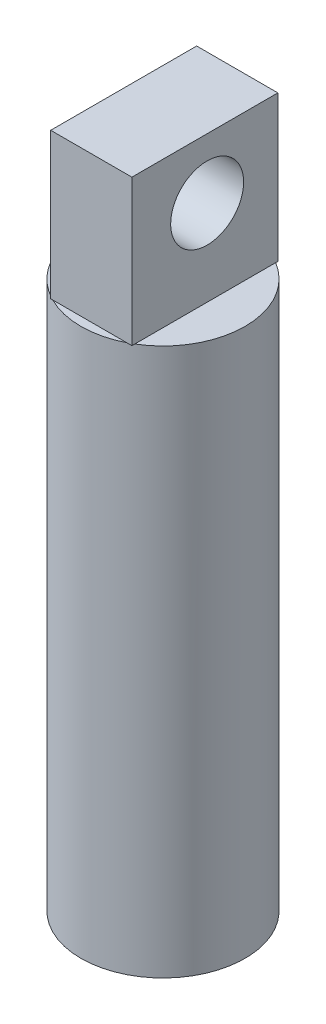
ISO-10303-21;
HEADER;
FILE_DESCRIPTION(('STEP AP214'),'2;1');
FILE_NAME('part.step','',(''),(''),'','','');
FILE_SCHEMA(('AUTOMOTIVE_DESIGN { 1 0 10303 214 1 1 1 1 }'));
ENDSEC;
DATA;
#1=APPLICATION_CONTEXT('core data for automotive mechanical design processes');
#2=APPLICATION_PROTOCOL_DEFINITION('international standard','automotive_design',2000,#1);
#3=PRODUCT_CONTEXT('',#1,'mechanical');
#4=PRODUCT('Part','Part','',(#3));
#5=PRODUCT_RELATED_PRODUCT_CATEGORY('part','',(#4));
#6=PRODUCT_DEFINITION_FORMATION('','',#4);
#7=PRODUCT_DEFINITION_CONTEXT('part definition',#1,'design');
#8=PRODUCT_DEFINITION('design','',#6,#7);
#9=PRODUCT_DEFINITION_SHAPE('','',#8);
#10=(LENGTH_UNIT() NAMED_UNIT(*) SI_UNIT(.MILLI.,.METRE.));
#11=(NAMED_UNIT(*) PLANE_ANGLE_UNIT() SI_UNIT($,.RADIAN.));
#12=(NAMED_UNIT(*) SI_UNIT($,.STERADIAN.) SOLID_ANGLE_UNIT());
#13=UNCERTAINTY_MEASURE_WITH_UNIT(LENGTH_MEASURE(1.E-05),#10,'distance_accuracy_value','');
#14=(GEOMETRIC_REPRESENTATION_CONTEXT(3) GLOBAL_UNCERTAINTY_ASSIGNED_CONTEXT((#13)) GLOBAL_UNIT_ASSIGNED_CONTEXT((#10,
#11,#12)) REPRESENTATION_CONTEXT('',''));
#15=CARTESIAN_POINT('',(0.,0.,0.));
#16=DIRECTION('',(0.,0.,1.));
#17=DIRECTION('',(1.,0.,0.));
#18=AXIS2_PLACEMENT_3D('',#15,#16,#17);
#19=CARTESIAN_POINT('',(-2.13739498432602,-5.30033333333333,8.));
#20=DIRECTION('',(0.,1.,0.));
#21=DIRECTION('',(0.,0.,1.));
#22=AXIS2_PLACEMENT_3D('',#19,#20,#21);
#23=PLANE('',#22);
#24=CARTESIAN_POINT('',(0.,-5.30033333333333,3.98343503850757));
#25=DIRECTION('',(0.,-1.,0.));
#26=DIRECTION('',(0.,0.,-1.));
#27=AXIS2_PLACEMENT_3D('',#24,#25,#26);
#28=CIRCLE('',#27,4.5);
#29=CARTESIAN_POINT('',(2.09338130640125,-5.30033333333333,0.));
#30=VERTEX_POINT('',#29);
#31=CARTESIAN_POINT('',(2.31260501567398,-5.30033333333333,0.123142557168939));
#32=VERTEX_POINT('',#31);
#33=EDGE_CURVE('E126',#30,#32,#28,.T.);
#34=ORIENTED_EDGE('',*,*,#33,.F.);
#35=DIRECTION('',(1.,0.,0.));
#36=VECTOR('',#35,1.);
#37=CARTESIAN_POINT('',(-2.13739498432602,-5.30033333333333,0.));
#38=LINE('',#37,#36);
#39=CARTESIAN_POINT('',(2.31260501567398,-5.30033333333333,0.));
#40=VERTEX_POINT('',#39);
#41=EDGE_CURVE('E111',#30,#40,#38,.T.);
#42=ORIENTED_EDGE('',*,*,#41,.T.);
#43=DIRECTION('',(0.,0.,-1.));
#44=VECTOR('',#43,1.);
#45=CARTESIAN_POINT('',(2.31260501567398,-5.30033333333333,8.));
#46=LINE('',#45,#44);
#47=EDGE_CURVE('E166',#32,#40,#46,.T.);
#48=ORIENTED_EDGE('',*,*,#47,.F.);
#49=EDGE_LOOP('',(#34,#42,#48));
#50=FACE_BOUND('',#49,.T.);
#51=ADVANCED_FACE('F34',(#50),#23,.F.);
#52=CARTESIAN_POINT('',(2.31260501567398,-5.30033333333333,7.8437275198462));
#53=VERTEX_POINT('',#52);
#54=CARTESIAN_POINT('',(2.02908992164253,-5.30033333333333,8.));
#55=VERTEX_POINT('',#54);
#56=EDGE_CURVE('E11',#53,#55,#28,.T.);
#57=ORIENTED_EDGE('',*,*,#56,.F.);
#58=CARTESIAN_POINT('',(2.31260501567398,-5.30033333333333,8.));
#59=VERTEX_POINT('',#58);
#60=EDGE_CURVE('E167',#59,#53,#46,.T.);
#61=ORIENTED_EDGE('',*,*,#60,.F.);
#62=DIRECTION('',(1.,0.,0.));
#63=VECTOR('',#62,1.);
#64=CARTESIAN_POINT('',(-2.13739498432602,-5.30033333333333,8.));
#65=LINE('',#64,#63);
#66=EDGE_CURVE('E149',#55,#59,#65,.T.);
#67=ORIENTED_EDGE('',*,*,#66,.F.);
#68=EDGE_LOOP('',(#57,#61,#67));
#69=FACE_BOUND('',#68,.T.);
#70=ADVANCED_FACE('F187',(#69),#23,.F.);
#71=CARTESIAN_POINT('',(-2.02908992164253,-5.30033333333333,8.));
#72=VERTEX_POINT('',#71);
#73=CARTESIAN_POINT('',(-2.13739498432602,-5.30033333333333,7.9434278012507));
#74=VERTEX_POINT('',#73);
#75=EDGE_CURVE('E43',#72,#74,#28,.T.);
#76=ORIENTED_EDGE('',*,*,#75,.F.);
#77=CARTESIAN_POINT('',(-2.13739498432602,-5.30033333333333,8.));
#78=VERTEX_POINT('',#77);
#79=EDGE_CURVE('E148',#78,#72,#65,.T.);
#80=ORIENTED_EDGE('',*,*,#79,.F.);
#81=DIRECTION('',(0.,0.,-1.));
#82=VECTOR('',#81,1.);
#83=CARTESIAN_POINT('',(-2.13739498432602,-5.30033333333333,8.));
#84=LINE('',#83,#82);
#85=EDGE_CURVE('E38',#78,#74,#84,.T.);
#86=ORIENTED_EDGE('',*,*,#85,.T.);
#87=EDGE_LOOP('',(#76,#80,#86));
#88=FACE_BOUND('',#87,.T.);
#89=ADVANCED_FACE('F189',(#88),#23,.F.);
#90=CARTESIAN_POINT('',(-2.13739498432602,2.69966666666667,8.));
#91=DIRECTION('',(1.,0.,0.));
#92=DIRECTION('',(0.,1.,0.));
#93=AXIS2_PLACEMENT_3D('',#90,#91,#92);
#94=PLANE('',#93);
#95=CARTESIAN_POINT('',(-2.13739498432602,-0.589342017035122,3.87570666961495));
#96=DIRECTION('',(1.,0.,0.));
#97=DIRECTION('',(0.,1.,0.));
#98=AXIS2_PLACEMENT_3D('',#95,#96,#97);
#99=CIRCLE('',#98,2.);
#100=CARTESIAN_POINT('',(-2.13739498432602,1.41065798296488,3.87570666961495));
#101=VERTEX_POINT('',#100);
#102=EDGE_CURVE('E125',#101,#101,#99,.T.);
#103=ORIENTED_EDGE('',*,*,#102,.T.);
#104=EDGE_LOOP('',(#103));
#105=FACE_BOUND('',#104,.T.);
#106=DIRECTION('',(0.,-1.,0.));
#107=VECTOR('',#106,1.);
#108=CARTESIAN_POINT('',(-2.13739498432602,2.69966666666667,0.));
#109=LINE('',#108,#107);
#110=CARTESIAN_POINT('',(-2.13739498432602,2.69966666666667,0.));
#111=VERTEX_POINT('',#110);
#112=CARTESIAN_POINT('',(-2.13739498432602,-5.30033333333333,0.));
#113=VERTEX_POINT('',#112);
#114=EDGE_CURVE('E136',#111,#113,#109,.T.);
#115=ORIENTED_EDGE('',*,*,#114,.T.);
#116=CARTESIAN_POINT('',(-2.13739498432602,-5.30033333333333,0.0234422757644393));
#117=VERTEX_POINT('',#116);
#118=EDGE_CURVE('E104',#117,#113,#84,.T.);
#119=ORIENTED_EDGE('',*,*,#118,.F.);
#120=EDGE_CURVE('E59',#74,#117,#84,.T.);
#121=ORIENTED_EDGE('',*,*,#120,.F.);
#122=ORIENTED_EDGE('',*,*,#85,.F.);
#123=DIRECTION('',(0.,-1.,0.));
#124=VECTOR('',#123,1.);
#125=CARTESIAN_POINT('',(-2.13739498432602,2.69966666666667,8.));
#126=LINE('',#125,#124);
#127=CARTESIAN_POINT('',(-2.13739498432602,2.69966666666667,8.));
#128=VERTEX_POINT('',#127);
#129=EDGE_CURVE('E152',#128,#78,#126,.T.);
#130=ORIENTED_EDGE('',*,*,#129,.F.);
#131=DIRECTION('',(0.,0.,-1.));
#132=VECTOR('',#131,1.);
#133=CARTESIAN_POINT('',(-2.13739498432602,2.69966666666667,8.));
#134=LINE('',#133,#132);
#135=EDGE_CURVE('E157',#128,#111,#134,.T.);
#136=ORIENTED_EDGE('',*,*,#135,.T.);
#137=EDGE_LOOP('',(#115,#119,#121,#122,#130,#136));
#138=FACE_BOUND('',#137,.T.);
#139=ADVANCED_FACE('F36',(#105,#138),#94,.F.);
#140=CARTESIAN_POINT('',(-2.09338130640125,-5.30033333333333,0.));
#141=VERTEX_POINT('',#140);
#142=EDGE_CURVE('E52',#117,#141,#28,.T.);
#143=ORIENTED_EDGE('',*,*,#142,.F.);
#144=ORIENTED_EDGE('',*,*,#118,.T.);
#145=EDGE_CURVE('E101',#113,#141,#38,.T.);
#146=ORIENTED_EDGE('',*,*,#145,.T.);
#147=EDGE_LOOP('',(#143,#144,#146));
#148=FACE_BOUND('',#147,.T.);
#149=ADVANCED_FACE('F103',(#148),#23,.F.);
#150=CARTESIAN_POINT('',(2.31260501567398,2.69966666666667,8.));
#151=DIRECTION('',(-1.,0.,0.));
#152=DIRECTION('',(0.,-1.,0.));
#153=AXIS2_PLACEMENT_3D('',#150,#151,#152);
#154=PLANE('',#153);
#155=CARTESIAN_POINT('',(2.31260501567398,-0.589342017035121,3.87570666961495));
#156=DIRECTION('',(1.,0.,0.));
#157=DIRECTION('',(0.,1.,0.));
#158=AXIS2_PLACEMENT_3D('',#155,#156,#157);
#159=CIRCLE('',#158,2.);
#160=CARTESIAN_POINT('',(2.31260501567398,1.41065798296488,3.87570666961495));
#161=VERTEX_POINT('',#160);
#162=EDGE_CURVE('E224',#161,#161,#159,.T.);
#163=ORIENTED_EDGE('',*,*,#162,.F.);
#164=EDGE_LOOP('',(#163));
#165=FACE_BOUND('',#164,.T.);
#166=DIRECTION('',(0.,1.,0.));
#167=VECTOR('',#166,1.);
#168=CARTESIAN_POINT('',(2.31260501567398,2.69966666666667,0.));
#169=LINE('',#168,#167);
#170=CARTESIAN_POINT('',(2.31260501567398,2.69966666666667,0.));
#171=VERTEX_POINT('',#170);
#172=EDGE_CURVE('E108',#40,#171,#169,.T.);
#173=ORIENTED_EDGE('',*,*,#172,.T.);
#174=DIRECTION('',(0.,0.,-1.));
#175=VECTOR('',#174,1.);
#176=CARTESIAN_POINT('',(2.31260501567398,2.69966666666667,8.));
#177=LINE('',#176,#175);
#178=CARTESIAN_POINT('',(2.31260501567398,2.69966666666667,8.));
#179=VERTEX_POINT('',#178);
#180=EDGE_CURVE('E164',#179,#171,#177,.T.);
#181=ORIENTED_EDGE('',*,*,#180,.F.);
#182=DIRECTION('',(0.,1.,0.));
#183=VECTOR('',#182,1.);
#184=CARTESIAN_POINT('',(2.31260501567398,2.69966666666667,8.));
#185=LINE('',#184,#183);
#186=EDGE_CURVE('E151',#59,#179,#185,.T.);
#187=ORIENTED_EDGE('',*,*,#186,.F.);
#188=ORIENTED_EDGE('',*,*,#60,.T.);
#189=EDGE_CURVE('E169',#53,#32,#46,.T.);
#190=ORIENTED_EDGE('',*,*,#189,.T.);
#191=ORIENTED_EDGE('',*,*,#47,.T.);
#192=EDGE_LOOP('',(#173,#181,#187,#188,#190,#191));
#193=FACE_BOUND('',#192,.T.);
#194=ADVANCED_FACE('F175',(#165,#193),#154,.F.);
#195=CARTESIAN_POINT('',(-2.13739498432602,2.69966666666667,8.));
#196=DIRECTION('',(0.,-1.,0.));
#197=DIRECTION('',(0.,0.,-1.));
#198=AXIS2_PLACEMENT_3D('',#195,#196,#197);
#199=PLANE('',#198);
#200=DIRECTION('',(-1.,0.,0.));
#201=VECTOR('',#200,1.);
#202=CARTESIAN_POINT('',(-2.13739498432602,2.69966666666667,0.));
#203=LINE('',#202,#201);
#204=EDGE_CURVE('E160',#171,#111,#203,.T.);
#205=ORIENTED_EDGE('',*,*,#204,.T.);
#206=ORIENTED_EDGE('',*,*,#135,.F.);
#207=DIRECTION('',(-1.,0.,0.));
#208=VECTOR('',#207,1.);
#209=CARTESIAN_POINT('',(-2.13739498432602,2.69966666666667,8.));
#210=LINE('',#209,#208);
#211=EDGE_CURVE('E155',#179,#128,#210,.T.);
#212=ORIENTED_EDGE('',*,*,#211,.F.);
#213=ORIENTED_EDGE('',*,*,#180,.T.);
#214=EDGE_LOOP('',(#205,#206,#212,#213));
#215=FACE_BOUND('',#214,.T.);
#216=ADVANCED_FACE('F181',(#215),#199,.F.);
#217=CARTESIAN_POINT('',(0.,0.,8.));
#218=DIRECTION('',(0.,0.,1.));
#219=DIRECTION('',(1.,0.,0.));
#220=AXIS2_PLACEMENT_3D('',#217,#218,#219);
#221=PLANE('',#220);
#222=ORIENTED_EDGE('',*,*,#129,.T.);
#223=ORIENTED_EDGE('',*,*,#79,.T.);
#224=EDGE_CURVE('E145',#72,#55,#65,.T.);
#225=ORIENTED_EDGE('',*,*,#224,.T.);
#226=ORIENTED_EDGE('',*,*,#66,.T.);
#227=ORIENTED_EDGE('',*,*,#186,.T.);
#228=ORIENTED_EDGE('',*,*,#211,.T.);
#229=EDGE_LOOP('',(#222,#223,#225,#226,#227,#228));
#230=FACE_BOUND('',#229,.T.);
#231=ADVANCED_FACE('F185',(#230),#221,.T.);
#232=CARTESIAN_POINT('',(0.,0.,0.));
#233=DIRECTION('',(0.,0.,1.));
#234=DIRECTION('',(1.,0.,0.));
#235=AXIS2_PLACEMENT_3D('',#232,#233,#234);
#236=PLANE('',#235);
#237=ORIENTED_EDGE('',*,*,#114,.F.);
#238=ORIENTED_EDGE('',*,*,#204,.F.);
#239=ORIENTED_EDGE('',*,*,#172,.F.);
#240=ORIENTED_EDGE('',*,*,#41,.F.);
#241=EDGE_CURVE('E109',#141,#30,#38,.T.);
#242=ORIENTED_EDGE('',*,*,#241,.F.);
#243=ORIENTED_EDGE('',*,*,#145,.F.);
#244=EDGE_LOOP('',(#237,#238,#239,#240,#242,#243));
#245=FACE_BOUND('',#244,.T.);
#246=ADVANCED_FACE('F115',(#245),#236,.F.);
#247=CARTESIAN_POINT('',(0.,-5.30033333333333,3.98343503850757));
#248=DIRECTION('',(0.,-1.,0.));
#249=DIRECTION('',(0.,0.,-1.));
#250=AXIS2_PLACEMENT_3D('',#247,#248,#249);
#251=PLANE('',#250);
#252=EDGE_CURVE('E120',#141,#30,#28,.T.);
#253=ORIENTED_EDGE('',*,*,#252,.F.);
#254=ORIENTED_EDGE('',*,*,#241,.T.);
#255=EDGE_LOOP('',(#253,#254));
#256=FACE_BOUND('',#255,.T.);
#257=ADVANCED_FACE('F121',(#256),#251,.F.);
#258=ORIENTED_EDGE('',*,*,#189,.F.);
#259=EDGE_CURVE('E45',#32,#53,#28,.T.);
#260=ORIENTED_EDGE('',*,*,#259,.F.);
#261=EDGE_LOOP('',(#258,#260));
#262=FACE_BOUND('',#261,.T.);
#263=ADVANCED_FACE('F263',(#262),#251,.F.);
#264=EDGE_CURVE('E124',#74,#117,#28,.T.);
#265=ORIENTED_EDGE('',*,*,#264,.F.);
#266=ORIENTED_EDGE('',*,*,#120,.T.);
#267=EDGE_LOOP('',(#265,#266));
#268=FACE_BOUND('',#267,.T.);
#269=ADVANCED_FACE('F209',(#268),#251,.F.);
#270=CARTESIAN_POINT('',(0.,-35.3003333333333,3.98343503850757));
#271=DIRECTION('',(0.,1.,0.));
#272=DIRECTION('',(0.,0.,1.));
#273=AXIS2_PLACEMENT_3D('',#270,#271,#272);
#274=CYLINDRICAL_SURFACE('',#273,4.5);
#275=CARTESIAN_POINT('',(0.,-35.3003333333333,3.98343503850757));
#276=DIRECTION('',(0.,-1.,0.));
#277=DIRECTION('',(0.,0.,-1.));
#278=AXIS2_PLACEMENT_3D('',#275,#276,#277);
#279=CIRCLE('',#278,4.5);
#280=CARTESIAN_POINT('',(0.,-35.3003333333333,-0.516564961492431));
#281=VERTEX_POINT('',#280);
#282=EDGE_CURVE('E133',#281,#281,#279,.T.);
#283=ORIENTED_EDGE('',*,*,#282,.F.);
#284=EDGE_LOOP('',(#283));
#285=FACE_BOUND('',#284,.T.);
#286=ORIENTED_EDGE('',*,*,#33,.T.);
#287=ORIENTED_EDGE('',*,*,#259,.T.);
#288=ORIENTED_EDGE('',*,*,#56,.T.);
#289=EDGE_CURVE('E137',#55,#72,#28,.T.);
#290=ORIENTED_EDGE('',*,*,#289,.T.);
#291=ORIENTED_EDGE('',*,*,#75,.T.);
#292=ORIENTED_EDGE('',*,*,#264,.T.);
#293=ORIENTED_EDGE('',*,*,#142,.T.);
#294=ORIENTED_EDGE('',*,*,#252,.T.);
#295=EDGE_LOOP('',(#286,#287,#288,#290,#291,#292,#293,#294));
#296=FACE_BOUND('',#295,.T.);
#297=ADVANCED_FACE('F128',(#285,#296),#274,.T.);
#298=CARTESIAN_POINT('',(0.,-35.3003333333333,3.98343503850757));
#299=DIRECTION('',(0.,-1.,0.));
#300=DIRECTION('',(0.,0.,-1.));
#301=AXIS2_PLACEMENT_3D('',#298,#299,#300);
#302=PLANE('',#301);
#303=ORIENTED_EDGE('',*,*,#282,.T.);
#304=EDGE_LOOP('',(#303));
#305=FACE_BOUND('',#304,.T.);
#306=ADVANCED_FACE('F208',(#305),#302,.T.);
#307=ORIENTED_EDGE('',*,*,#224,.F.);
#308=ORIENTED_EDGE('',*,*,#289,.F.);
#309=EDGE_LOOP('',(#307,#308));
#310=FACE_BOUND('',#309,.T.);
#311=ADVANCED_FACE('F143',(#310),#251,.F.);
#312=CARTESIAN_POINT('',(-15.687394984326,-0.589342017035123,3.87570666961495));
#313=DIRECTION('',(1.,0.,0.));
#314=DIRECTION('',(0.,1.,0.));
#315=AXIS2_PLACEMENT_3D('',#312,#313,#314);
#316=CYLINDRICAL_SURFACE('',#315,2.);
#317=ORIENTED_EDGE('',*,*,#162,.T.);
#318=EDGE_LOOP('',(#317));
#319=FACE_BOUND('',#318,.T.);
#320=ORIENTED_EDGE('',*,*,#102,.F.);
#321=EDGE_LOOP('',(#320));
#322=FACE_BOUND('',#321,.T.);
#323=ADVANCED_FACE('F213',(#319,#322),#316,.F.);
#324=CLOSED_SHELL('',(#51,#70,#89,#139,#149,#194,#216,#231,#246,#257,#263,#269,#297,#306,#311,#323));
#325=MANIFOLD_SOLID_BREP('B2',#324);
#326=ADVANCED_BREP_SHAPE_REPRESENTATION('',(#18,#325),#14);
#327=SHAPE_DEFINITION_REPRESENTATION(#9,#326);
ENDSEC;
END-ISO-10303-21;
